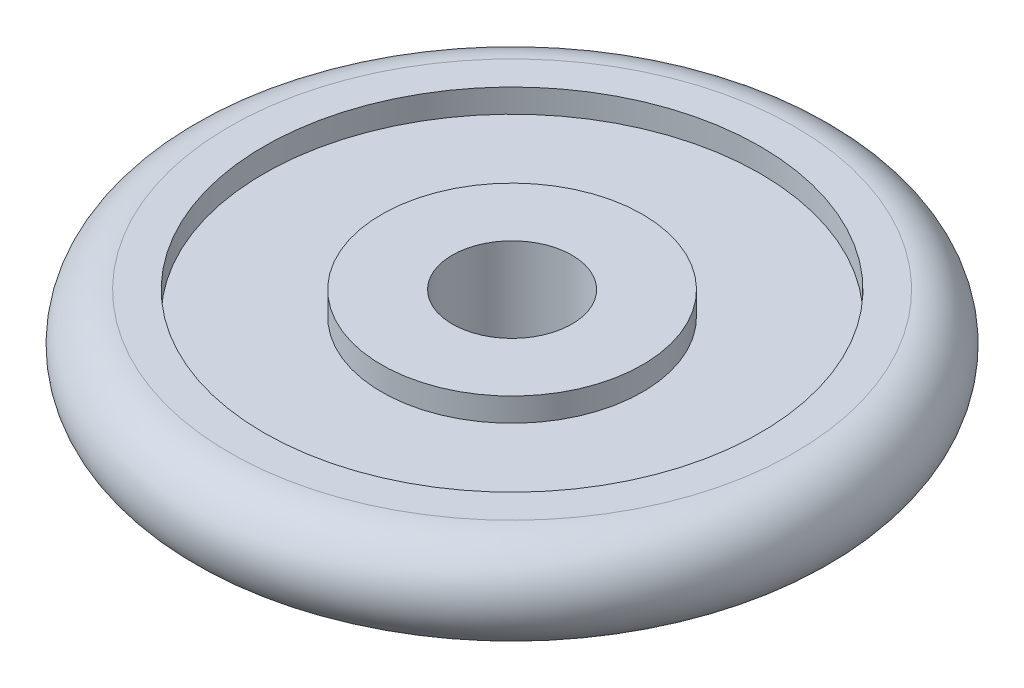
ISO-10303-21;
HEADER;
FILE_DESCRIPTION(('STEP AP214'),'2;1');
FILE_NAME('part.step','',(''),(''),'','','');
FILE_SCHEMA(('AUTOMOTIVE_DESIGN { 1 0 10303 214 1 1 1 1 }'));
ENDSEC;
DATA;
#1=APPLICATION_CONTEXT('core data for automotive mechanical design processes');
#2=APPLICATION_PROTOCOL_DEFINITION('international standard','automotive_design',2000,#1);
#3=PRODUCT_CONTEXT('',#1,'mechanical');
#4=PRODUCT('Part','Part','',(#3));
#5=PRODUCT_RELATED_PRODUCT_CATEGORY('part','',(#4));
#6=PRODUCT_DEFINITION_FORMATION('','',#4);
#7=PRODUCT_DEFINITION_CONTEXT('part definition',#1,'design');
#8=PRODUCT_DEFINITION('design','',#6,#7);
#9=PRODUCT_DEFINITION_SHAPE('','',#8);
#10=(LENGTH_UNIT() NAMED_UNIT(*) SI_UNIT(.MILLI.,.METRE.));
#11=(NAMED_UNIT(*) PLANE_ANGLE_UNIT() SI_UNIT($,.RADIAN.));
#12=(NAMED_UNIT(*) SI_UNIT($,.STERADIAN.) SOLID_ANGLE_UNIT());
#13=UNCERTAINTY_MEASURE_WITH_UNIT(LENGTH_MEASURE(1.E-05),#10,'distance_accuracy_value','');
#14=(GEOMETRIC_REPRESENTATION_CONTEXT(3) GLOBAL_UNCERTAINTY_ASSIGNED_CONTEXT((#13)) GLOBAL_UNIT_ASSIGNED_CONTEXT((#10,
#11,#12)) REPRESENTATION_CONTEXT('',''));
#15=CARTESIAN_POINT('',(0.,0.,0.));
#16=DIRECTION('',(0.,0.,1.));
#17=DIRECTION('',(1.,0.,0.));
#18=AXIS2_PLACEMENT_3D('',#15,#16,#17);
#19=CARTESIAN_POINT('',(12.7,-10.,0.));
#20=DIRECTION('',(0.,-1.,0.));
#21=DIRECTION('',(0.,0.,-1.));
#22=AXIS2_PLACEMENT_3D('',#19,#20,#21);
#23=PLANE('',#22);
#24=CARTESIAN_POINT('',(0.,-10.,0.));
#25=DIRECTION('',(0.,-1.,0.));
#26=DIRECTION('',(0.,0.,-1.));
#27=AXIS2_PLACEMENT_3D('',#24,#25,#26);
#28=CIRCLE('',#27,27.7);
#29=CARTESIAN_POINT('',(0.,-10.,-27.7));
#30=VERTEX_POINT('',#29);
#31=EDGE_CURVE('E10',#30,#30,#28,.T.);
#32=ORIENTED_EDGE('',*,*,#31,.T.);
#33=EDGE_LOOP('',(#32));
#34=FACE_BOUND('',#33,.T.);
#35=CARTESIAN_POINT('',(0.,-10.,0.));
#36=DIRECTION('',(0.,-1.,0.));
#37=DIRECTION('',(0.,0.,-1.));
#38=AXIS2_PLACEMENT_3D('',#35,#36,#37);
#39=CIRCLE('',#38,12.7);
#40=CARTESIAN_POINT('',(0.,-10.,-12.7));
#41=VERTEX_POINT('',#40);
#42=EDGE_CURVE('E74',#41,#41,#39,.T.);
#43=ORIENTED_EDGE('',*,*,#42,.F.);
#44=EDGE_LOOP('',(#43));
#45=FACE_BOUND('',#44,.T.);
#46=ADVANCED_FACE('F34',(#34,#45),#23,.T.);
#47=CARTESIAN_POINT('',(0.,0.,0.));
#48=DIRECTION('',(0.,-1.,0.));
#49=DIRECTION('',(0.,0.,-1.));
#50=AXIS2_PLACEMENT_3D('',#47,#48,#49);
#51=CYLINDRICAL_SURFACE('',#50,27.7);
#52=CARTESIAN_POINT('',(0.,-5.00000000000001,0.));
#53=DIRECTION('',(0.,-1.,0.));
#54=DIRECTION('',(0.,0.,-1.));
#55=AXIS2_PLACEMENT_3D('',#52,#53,#54);
#56=CIRCLE('',#55,27.7);
#57=CARTESIAN_POINT('',(0.,-5.00000000000001,-27.7));
#58=VERTEX_POINT('',#57);
#59=EDGE_CURVE('E40',#58,#58,#56,.T.);
#60=ORIENTED_EDGE('',*,*,#59,.T.);
#61=EDGE_LOOP('',(#60));
#62=FACE_BOUND('',#61,.T.);
#63=ORIENTED_EDGE('',*,*,#31,.F.);
#64=EDGE_LOOP('',(#63));
#65=FACE_BOUND('',#64,.T.);
#66=ADVANCED_FACE('F82',(#62,#65),#51,.T.);
#67=CARTESIAN_POINT('',(27.7,-5.00000000000001,0.));
#68=DIRECTION('',(0.,-1.,0.));
#69=DIRECTION('',(0.,0.,-1.));
#70=AXIS2_PLACEMENT_3D('',#67,#68,#69);
#71=PLANE('',#70);
#72=CARTESIAN_POINT('',(0.,-5.00000000000001,0.));
#73=DIRECTION('',(0.,-1.,0.));
#74=DIRECTION('',(0.,0.,-1.));
#75=AXIS2_PLACEMENT_3D('',#72,#73,#74);
#76=CIRCLE('',#75,52.7);
#77=CARTESIAN_POINT('',(0.,-5.00000000000001,-52.7));
#78=VERTEX_POINT('',#77);
#79=EDGE_CURVE('E44',#78,#78,#76,.T.);
#80=ORIENTED_EDGE('',*,*,#79,.T.);
#81=EDGE_LOOP('',(#80));
#82=FACE_BOUND('',#81,.T.);
#83=ORIENTED_EDGE('',*,*,#59,.F.);
#84=EDGE_LOOP('',(#83));
#85=FACE_BOUND('',#84,.T.);
#86=ADVANCED_FACE('F86',(#82,#85),#71,.T.);
#87=CARTESIAN_POINT('',(0.,0.,0.));
#88=DIRECTION('',(0.,-1.,0.));
#89=DIRECTION('',(0.,0.,-1.));
#90=AXIS2_PLACEMENT_3D('',#87,#88,#89);
#91=CYLINDRICAL_SURFACE('',#90,52.7);
#92=CARTESIAN_POINT('',(0.,-10.,0.));
#93=DIRECTION('',(0.,-1.,0.));
#94=DIRECTION('',(0.,0.,-1.));
#95=AXIS2_PLACEMENT_3D('',#92,#93,#94);
#96=CIRCLE('',#95,52.7);
#97=CARTESIAN_POINT('',(0.,-10.,-52.7));
#98=VERTEX_POINT('',#97);
#99=EDGE_CURVE('E48',#98,#98,#96,.T.);
#100=ORIENTED_EDGE('',*,*,#99,.T.);
#101=EDGE_LOOP('',(#100));
#102=FACE_BOUND('',#101,.T.);
#103=ORIENTED_EDGE('',*,*,#79,.F.);
#104=EDGE_LOOP('',(#103));
#105=FACE_BOUND('',#104,.T.);
#106=ADVANCED_FACE('F90',(#102,#105),#91,.F.);
#107=CARTESIAN_POINT('',(52.7,-10.,0.));
#108=DIRECTION('',(0.,-1.,0.));
#109=DIRECTION('',(0.,0.,-1.));
#110=AXIS2_PLACEMENT_3D('',#107,#108,#109);
#111=PLANE('',#110);
#112=CARTESIAN_POINT('',(0.,-10.,0.));
#113=DIRECTION('',(0.,-1.,0.));
#114=DIRECTION('',(0.,0.,-1.));
#115=AXIS2_PLACEMENT_3D('',#112,#113,#114);
#116=CIRCLE('',#115,60.);
#117=CARTESIAN_POINT('',(0.,-10.,-60.));
#118=VERTEX_POINT('',#117);
#119=EDGE_CURVE('E53',#118,#118,#116,.T.);
#120=ORIENTED_EDGE('',*,*,#119,.T.);
#121=EDGE_LOOP('',(#120));
#122=FACE_BOUND('',#121,.T.);
#123=ORIENTED_EDGE('',*,*,#99,.F.);
#124=EDGE_LOOP('',(#123));
#125=FACE_BOUND('',#124,.T.);
#126=ADVANCED_FACE('F97',(#122,#125),#111,.T.);
#127=CARTESIAN_POINT('',(0.,0.,0.));
#128=DIRECTION('',(0.,-1.,0.));
#129=DIRECTION('',(0.,0.,-1.));
#130=AXIS2_PLACEMENT_3D('',#127,#128,#129);
#131=TOROIDAL_SURFACE('',#130,60.,10.);
#132=CARTESIAN_POINT('',(0.,10.,0.));
#133=DIRECTION('',(0.,-1.,0.));
#134=DIRECTION('',(0.,0.,-1.));
#135=AXIS2_PLACEMENT_3D('',#132,#133,#134);
#136=CIRCLE('',#135,60.);
#137=CARTESIAN_POINT('',(0.,10.,-60.));
#138=VERTEX_POINT('',#137);
#139=EDGE_CURVE('E56',#138,#138,#136,.T.);
#140=ORIENTED_EDGE('',*,*,#139,.T.);
#141=EDGE_LOOP('',(#140));
#142=FACE_BOUND('',#141,.T.);
#143=ORIENTED_EDGE('',*,*,#119,.F.);
#144=EDGE_LOOP('',(#143));
#145=FACE_BOUND('',#144,.T.);
#146=ADVANCED_FACE('F101',(#142,#145),#131,.T.);
#147=CARTESIAN_POINT('',(52.7,10.,0.));
#148=DIRECTION('',(0.,1.,0.));
#149=DIRECTION('',(0.,0.,1.));
#150=AXIS2_PLACEMENT_3D('',#147,#148,#149);
#151=PLANE('',#150);
#152=CARTESIAN_POINT('',(0.,10.,0.));
#153=DIRECTION('',(0.,-1.,0.));
#154=DIRECTION('',(0.,0.,-1.));
#155=AXIS2_PLACEMENT_3D('',#152,#153,#154);
#156=CIRCLE('',#155,52.7);
#157=CARTESIAN_POINT('',(0.,10.,-52.7));
#158=VERTEX_POINT('',#157);
#159=EDGE_CURVE('E59',#158,#158,#156,.T.);
#160=ORIENTED_EDGE('',*,*,#159,.T.);
#161=EDGE_LOOP('',(#160));
#162=FACE_BOUND('',#161,.T.);
#163=ORIENTED_EDGE('',*,*,#139,.F.);
#164=EDGE_LOOP('',(#163));
#165=FACE_BOUND('',#164,.T.);
#166=ADVANCED_FACE('F105',(#162,#165),#151,.T.);
#167=CARTESIAN_POINT('',(0.,0.,0.));
#168=DIRECTION('',(0.,-1.,0.));
#169=DIRECTION('',(0.,0.,-1.));
#170=AXIS2_PLACEMENT_3D('',#167,#168,#169);
#171=CYLINDRICAL_SURFACE('',#170,52.7);
#172=CARTESIAN_POINT('',(0.,5.00000000000001,0.));
#173=DIRECTION('',(0.,-1.,0.));
#174=DIRECTION('',(0.,0.,-1.));
#175=AXIS2_PLACEMENT_3D('',#172,#173,#174);
#176=CIRCLE('',#175,52.7);
#177=CARTESIAN_POINT('',(0.,5.00000000000001,-52.7));
#178=VERTEX_POINT('',#177);
#179=EDGE_CURVE('E62',#178,#178,#176,.T.);
#180=ORIENTED_EDGE('',*,*,#179,.T.);
#181=EDGE_LOOP('',(#180));
#182=FACE_BOUND('',#181,.T.);
#183=ORIENTED_EDGE('',*,*,#159,.F.);
#184=EDGE_LOOP('',(#183));
#185=FACE_BOUND('',#184,.T.);
#186=ADVANCED_FACE('F109',(#182,#185),#171,.F.);
#187=CARTESIAN_POINT('',(27.7,5.00000000000001,0.));
#188=DIRECTION('',(0.,1.,0.));
#189=DIRECTION('',(0.,0.,1.));
#190=AXIS2_PLACEMENT_3D('',#187,#188,#189);
#191=PLANE('',#190);
#192=CARTESIAN_POINT('',(0.,5.00000000000001,0.));
#193=DIRECTION('',(0.,-1.,0.));
#194=DIRECTION('',(0.,0.,-1.));
#195=AXIS2_PLACEMENT_3D('',#192,#193,#194);
#196=CIRCLE('',#195,27.7);
#197=CARTESIAN_POINT('',(0.,5.00000000000001,-27.7));
#198=VERTEX_POINT('',#197);
#199=EDGE_CURVE('E65',#198,#198,#196,.T.);
#200=ORIENTED_EDGE('',*,*,#199,.T.);
#201=EDGE_LOOP('',(#200));
#202=FACE_BOUND('',#201,.T.);
#203=ORIENTED_EDGE('',*,*,#179,.F.);
#204=EDGE_LOOP('',(#203));
#205=FACE_BOUND('',#204,.T.);
#206=ADVANCED_FACE('F113',(#202,#205),#191,.T.);
#207=CARTESIAN_POINT('',(0.,0.,0.));
#208=DIRECTION('',(0.,-1.,0.));
#209=DIRECTION('',(0.,0.,-1.));
#210=AXIS2_PLACEMENT_3D('',#207,#208,#209);
#211=CYLINDRICAL_SURFACE('',#210,27.7);
#212=CARTESIAN_POINT('',(0.,10.,0.));
#213=DIRECTION('',(0.,-1.,0.));
#214=DIRECTION('',(0.,0.,-1.));
#215=AXIS2_PLACEMENT_3D('',#212,#213,#214);
#216=CIRCLE('',#215,27.7);
#217=CARTESIAN_POINT('',(0.,10.,-27.7));
#218=VERTEX_POINT('',#217);
#219=EDGE_CURVE('E68',#218,#218,#216,.T.);
#220=ORIENTED_EDGE('',*,*,#219,.T.);
#221=EDGE_LOOP('',(#220));
#222=FACE_BOUND('',#221,.T.);
#223=ORIENTED_EDGE('',*,*,#199,.F.);
#224=EDGE_LOOP('',(#223));
#225=FACE_BOUND('',#224,.T.);
#226=ADVANCED_FACE('F117',(#222,#225),#211,.T.);
#227=CARTESIAN_POINT('',(12.7,10.,0.));
#228=DIRECTION('',(0.,1.,0.));
#229=DIRECTION('',(0.,0.,1.));
#230=AXIS2_PLACEMENT_3D('',#227,#228,#229);
#231=PLANE('',#230);
#232=CARTESIAN_POINT('',(0.,10.,0.));
#233=DIRECTION('',(0.,-1.,0.));
#234=DIRECTION('',(0.,0.,-1.));
#235=AXIS2_PLACEMENT_3D('',#232,#233,#234);
#236=CIRCLE('',#235,12.7);
#237=CARTESIAN_POINT('',(0.,10.,-12.7));
#238=VERTEX_POINT('',#237);
#239=EDGE_CURVE('E71',#238,#238,#236,.T.);
#240=ORIENTED_EDGE('',*,*,#239,.T.);
#241=EDGE_LOOP('',(#240));
#242=FACE_BOUND('',#241,.T.);
#243=ORIENTED_EDGE('',*,*,#219,.F.);
#244=EDGE_LOOP('',(#243));
#245=FACE_BOUND('',#244,.T.);
#246=ADVANCED_FACE('F121',(#242,#245),#231,.T.);
#247=CARTESIAN_POINT('',(0.,0.,0.));
#248=DIRECTION('',(0.,-1.,0.));
#249=DIRECTION('',(0.,0.,-1.));
#250=AXIS2_PLACEMENT_3D('',#247,#248,#249);
#251=CYLINDRICAL_SURFACE('',#250,12.7);
#252=ORIENTED_EDGE('',*,*,#42,.T.);
#253=EDGE_LOOP('',(#252));
#254=FACE_BOUND('',#253,.T.);
#255=ORIENTED_EDGE('',*,*,#239,.F.);
#256=EDGE_LOOP('',(#255));
#257=FACE_BOUND('',#256,.T.);
#258=ADVANCED_FACE('F78',(#254,#257),#251,.F.);
#259=CLOSED_SHELL('',(#46,#66,#86,#106,#126,#146,#166,#186,#206,#226,#246,#258));
#260=MANIFOLD_SOLID_BREP('B2',#259);
#261=ADVANCED_BREP_SHAPE_REPRESENTATION('',(#18,#260),#14);
#262=SHAPE_DEFINITION_REPRESENTATION(#9,#261);
ENDSEC;
END-ISO-10303-21;
